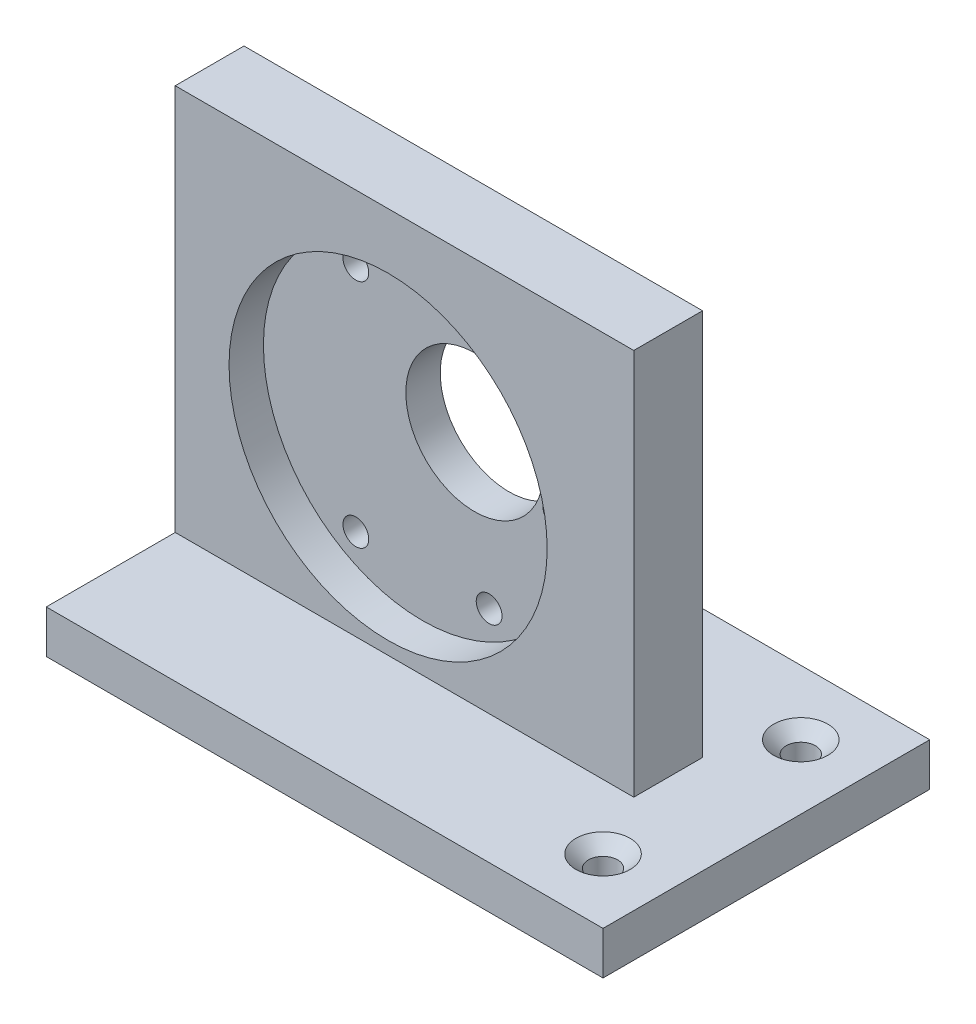
ISO-10303-21;
HEADER;
FILE_DESCRIPTION(('STEP AP214'),'2;1');
FILE_NAME('part.step','',(''),(''),'','','');
FILE_SCHEMA(('AUTOMOTIVE_DESIGN { 1 0 10303 214 1 1 1 1 }'));
ENDSEC;
DATA;
#1=APPLICATION_CONTEXT('core data for automotive mechanical design processes');
#2=APPLICATION_PROTOCOL_DEFINITION('international standard','automotive_design',2000,#1);
#3=PRODUCT_CONTEXT('',#1,'mechanical');
#4=PRODUCT('Part','Part','',(#3));
#5=PRODUCT_RELATED_PRODUCT_CATEGORY('part','',(#4));
#6=PRODUCT_DEFINITION_FORMATION('','',#4);
#7=PRODUCT_DEFINITION_CONTEXT('part definition',#1,'design');
#8=PRODUCT_DEFINITION('design','',#6,#7);
#9=PRODUCT_DEFINITION_SHAPE('','',#8);
#10=(LENGTH_UNIT() NAMED_UNIT(*) SI_UNIT(.MILLI.,.METRE.));
#11=(NAMED_UNIT(*) PLANE_ANGLE_UNIT() SI_UNIT($,.RADIAN.));
#12=(NAMED_UNIT(*) SI_UNIT($,.STERADIAN.) SOLID_ANGLE_UNIT());
#13=UNCERTAINTY_MEASURE_WITH_UNIT(LENGTH_MEASURE(1.E-05),#10,'distance_accuracy_value','');
#14=(GEOMETRIC_REPRESENTATION_CONTEXT(3) GLOBAL_UNCERTAINTY_ASSIGNED_CONTEXT((#13)) GLOBAL_UNIT_ASSIGNED_CONTEXT((#10,
#11,#12)) REPRESENTATION_CONTEXT('',''));
#15=CARTESIAN_POINT('',(0.,0.,0.));
#16=DIRECTION('',(0.,0.,1.));
#17=DIRECTION('',(1.,0.,0.));
#18=AXIS2_PLACEMENT_3D('',#15,#16,#17);
#19=CARTESIAN_POINT('',(-40.,5.,23.));
#20=DIRECTION('',(0.,-1.,0.));
#21=DIRECTION('',(1.,0.,0.));
#22=AXIS2_PLACEMENT_3D('',#19,#20,#21);
#23=PLANE('',#22);
#24=CARTESIAN_POINT('',(32.5,5.00000000000002,-7.5));
#25=DIRECTION('',(0.,1.,0.));
#26=DIRECTION('',(0.,0.,1.));
#27=AXIS2_PLACEMENT_3D('',#24,#25,#26);
#28=CIRCLE('',#27,3.15);
#29=CARTESIAN_POINT('',(32.5,5.00000000000002,-4.35));
#30=VERTEX_POINT('',#29);
#31=EDGE_CURVE('E537',#30,#30,#28,.T.);
#32=ORIENTED_EDGE('',*,*,#31,.F.);
#33=EDGE_LOOP('',(#32));
#34=FACE_BOUND('',#33,.T.);
#35=CARTESIAN_POINT('',(32.5,5.00000000000002,15.5));
#36=DIRECTION('',(0.,1.,0.));
#37=DIRECTION('',(0.,0.,1.));
#38=AXIS2_PLACEMENT_3D('',#35,#36,#37);
#39=CIRCLE('',#38,3.15);
#40=CARTESIAN_POINT('',(32.5,5.00000000000002,18.65));
#41=VERTEX_POINT('',#40);
#42=EDGE_CURVE('E549',#41,#41,#39,.T.);
#43=ORIENTED_EDGE('',*,*,#42,.F.);
#44=EDGE_LOOP('',(#43));
#45=FACE_BOUND('',#44,.T.);
#46=DIRECTION('',(0.,0.,-1.));
#47=VECTOR('',#46,1.);
#48=CARTESIAN_POINT('',(-24.76,5.,23.));
#49=LINE('',#48,#47);
#50=CARTESIAN_POINT('',(-24.76,5.00000000000002,23.));
#51=VERTEX_POINT('',#50);
#52=CARTESIAN_POINT('',(-24.76,5.,8.));
#53=VERTEX_POINT('',#52);
#54=EDGE_CURVE('E265',#51,#53,#49,.T.);
#55=ORIENTED_EDGE('',*,*,#54,.F.);
#56=DIRECTION('',(-1.,0.,0.));
#57=VECTOR('',#56,1.);
#58=CARTESIAN_POINT('',(-40.,5.,23.));
#59=LINE('',#58,#57);
#60=CARTESIAN_POINT('',(40.,5.00000000000002,23.));
#61=VERTEX_POINT('',#60);
#62=EDGE_CURVE('E133',#61,#51,#59,.T.);
#63=ORIENTED_EDGE('',*,*,#62,.F.);
#64=DIRECTION('',(0.,0.,-1.));
#65=VECTOR('',#64,1.);
#66=CARTESIAN_POINT('',(40.,5.00000000000002,23.));
#67=LINE('',#66,#65);
#68=CARTESIAN_POINT('',(40.,5.00000000000002,-15.));
#69=VERTEX_POINT('',#68);
#70=EDGE_CURVE('E155',#61,#69,#67,.T.);
#71=ORIENTED_EDGE('',*,*,#70,.T.);
#72=DIRECTION('',(-1.,0.,0.));
#73=VECTOR('',#72,1.);
#74=CARTESIAN_POINT('',(-40.,5.,-15.));
#75=LINE('',#74,#73);
#76=CARTESIAN_POINT('',(-24.76,5.00000000000002,-15.));
#77=VERTEX_POINT('',#76);
#78=EDGE_CURVE('E143',#69,#77,#75,.T.);
#79=ORIENTED_EDGE('',*,*,#78,.T.);
#80=CARTESIAN_POINT('',(-24.76,5.,0.));
#81=VERTEX_POINT('',#80);
#82=EDGE_CURVE('E266',#81,#77,#49,.T.);
#83=ORIENTED_EDGE('',*,*,#82,.F.);
#84=DIRECTION('',(-1.,0.,0.));
#85=VECTOR('',#84,1.);
#86=CARTESIAN_POINT('',(0.,5.00000000000001,0.));
#87=LINE('',#86,#85);
#88=CARTESIAN_POINT('',(28.575,5.00000000000001,0.));
#89=VERTEX_POINT('',#88);
#90=EDGE_CURVE('E12',#89,#81,#87,.T.);
#91=ORIENTED_EDGE('',*,*,#90,.F.);
#92=DIRECTION('',(0.,0.,-1.));
#93=VECTOR('',#92,1.);
#94=CARTESIAN_POINT('',(28.575,5.00000000000001,8.));
#95=LINE('',#94,#93);
#96=CARTESIAN_POINT('',(28.575,5.00000000000001,8.));
#97=VERTEX_POINT('',#96);
#98=EDGE_CURVE('E160',#97,#89,#95,.T.);
#99=ORIENTED_EDGE('',*,*,#98,.F.);
#100=DIRECTION('',(-1.,0.,0.));
#101=VECTOR('',#100,1.);
#102=CARTESIAN_POINT('',(0.,5.00000000000001,8.));
#103=LINE('',#102,#101);
#104=EDGE_CURVE('E164',#97,#53,#103,.T.);
#105=ORIENTED_EDGE('',*,*,#104,.T.);
#106=EDGE_LOOP('',(#55,#63,#71,#79,#83,#91,#99,#105));
#107=FACE_BOUND('',#106,.T.);
#108=ADVANCED_FACE('F51',(#34,#45,#107),#23,.F.);
#109=CARTESIAN_POINT('',(0.,0.,8.));
#110=DIRECTION('',(0.,0.,-1.));
#111=DIRECTION('',(-1.,0.,0.));
#112=AXIS2_PLACEMENT_3D('',#109,#110,#111);
#113=PLANE('',#112);
#114=CARTESIAN_POINT('',(0.,25.,8.));
#115=DIRECTION('',(0.,0.,1.));
#116=DIRECTION('',(1.,0.,0.));
#117=AXIS2_PLACEMENT_3D('',#114,#115,#116);
#118=CIRCLE('',#117,18.5);
#119=CARTESIAN_POINT('',(18.5,25.,8.));
#120=VERTEX_POINT('',#119);
#121=EDGE_CURVE('E168',#120,#120,#118,.T.);
#122=ORIENTED_EDGE('',*,*,#121,.F.);
#123=EDGE_LOOP('',(#122));
#124=FACE_BOUND('',#123,.T.);
#125=DIRECTION('',(0.,1.,0.));
#126=VECTOR('',#125,1.);
#127=CARTESIAN_POINT('',(-24.76,0.,8.));
#128=LINE('',#127,#126);
#129=CARTESIAN_POINT('',(-24.76,50.,8.));
#130=VERTEX_POINT('',#129);
#131=EDGE_CURVE('E262',#53,#130,#128,.T.);
#132=ORIENTED_EDGE('',*,*,#131,.F.);
#133=ORIENTED_EDGE('',*,*,#104,.F.);
#134=DIRECTION('',(0.,-1.,0.));
#135=VECTOR('',#134,1.);
#136=CARTESIAN_POINT('',(28.575,50.,8.));
#137=LINE('',#136,#135);
#138=CARTESIAN_POINT('',(28.575,50.,8.));
#139=VERTEX_POINT('',#138);
#140=EDGE_CURVE('E224',#139,#97,#137,.T.);
#141=ORIENTED_EDGE('',*,*,#140,.F.);
#142=DIRECTION('',(1.,0.,0.));
#143=VECTOR('',#142,1.);
#144=CARTESIAN_POINT('',(-28.575,50.,8.));
#145=LINE('',#144,#143);
#146=EDGE_CURVE('E76',#130,#139,#145,.T.);
#147=ORIENTED_EDGE('',*,*,#146,.F.);
#148=EDGE_LOOP('',(#132,#133,#141,#147));
#149=FACE_BOUND('',#148,.T.);
#150=ADVANCED_FACE('F255',(#124,#149),#113,.F.);
#151=CARTESIAN_POINT('',(0.,0.,0.));
#152=DIRECTION('',(0.,0.,-1.));
#153=DIRECTION('',(-1.,0.,0.));
#154=AXIS2_PLACEMENT_3D('',#151,#152,#153);
#155=PLANE('',#154);
#156=CARTESIAN_POINT('',(-7.74999999999999,38.4233937586588,0.));
#157=DIRECTION('',(0.,0.,1.));
#158=DIRECTION('',(1.,0.,0.));
#159=AXIS2_PLACEMENT_3D('',#156,#157,#158);
#160=CIRCLE('',#159,1.50000000039213);
#161=CARTESIAN_POINT('',(-6.24999999960786,38.4233937586588,0.));
#162=VERTEX_POINT('',#161);
#163=EDGE_CURVE('E202',#162,#162,#160,.T.);
#164=ORIENTED_EDGE('',*,*,#163,.T.);
#165=EDGE_LOOP('',(#164));
#166=FACE_BOUND('',#165,.T.);
#167=CARTESIAN_POINT('',(-7.74999999999999,11.5766062413412,0.));
#168=DIRECTION('',(0.,0.,1.));
#169=DIRECTION('',(1.,0.,0.));
#170=AXIS2_PLACEMENT_3D('',#167,#168,#169);
#171=CIRCLE('',#170,1.50000000039213);
#172=CARTESIAN_POINT('',(-6.24999999960786,11.5766062413412,0.));
#173=VERTEX_POINT('',#172);
#174=EDGE_CURVE('E207',#173,#173,#171,.T.);
#175=ORIENTED_EDGE('',*,*,#174,.T.);
#176=EDGE_LOOP('',(#175));
#177=FACE_BOUND('',#176,.T.);
#178=CARTESIAN_POINT('',(7.75000000000001,11.5766062413412,0.));
#179=DIRECTION('',(0.,0.,1.));
#180=DIRECTION('',(1.,0.,0.));
#181=AXIS2_PLACEMENT_3D('',#178,#179,#180);
#182=CIRCLE('',#181,1.50000000039213);
#183=CARTESIAN_POINT('',(9.25000000039214,11.5766062413412,0.));
#184=VERTEX_POINT('',#183);
#185=EDGE_CURVE('E211',#184,#184,#182,.T.);
#186=ORIENTED_EDGE('',*,*,#185,.T.);
#187=EDGE_LOOP('',(#186));
#188=FACE_BOUND('',#187,.T.);
#189=CARTESIAN_POINT('',(15.5,25.,0.));
#190=DIRECTION('',(0.,0.,1.));
#191=DIRECTION('',(1.,0.,0.));
#192=AXIS2_PLACEMENT_3D('',#189,#190,#191);
#193=CIRCLE('',#192,1.50000000039213);
#194=CARTESIAN_POINT('',(17.0000000003921,25.,0.));
#195=VERTEX_POINT('',#194);
#196=EDGE_CURVE('E201',#195,#195,#193,.T.);
#197=ORIENTED_EDGE('',*,*,#196,.T.);
#198=EDGE_LOOP('',(#197));
#199=FACE_BOUND('',#198,.T.);
#200=CARTESIAN_POINT('',(6.06217782532956,28.4999999993294,0.));
#201=DIRECTION('',(0.,0.,1.));
#202=DIRECTION('',(1.,0.,0.));
#203=AXIS2_PLACEMENT_3D('',#200,#201,#202);
#204=CIRCLE('',#203,8.00000000000001);
#205=CARTESIAN_POINT('',(14.0621778253296,28.4999999993294,0.));
#206=VERTEX_POINT('',#205);
#207=EDGE_CURVE('E197',#206,#206,#204,.T.);
#208=ORIENTED_EDGE('',*,*,#207,.T.);
#209=EDGE_LOOP('',(#208));
#210=FACE_BOUND('',#209,.T.);
#211=CARTESIAN_POINT('',(7.74999999999999,38.4233937586588,0.));
#212=DIRECTION('',(0.,0.,1.));
#213=DIRECTION('',(1.,0.,0.));
#214=AXIS2_PLACEMENT_3D('',#211,#212,#213);
#215=CIRCLE('',#214,1.50000000039214);
#216=CARTESIAN_POINT('',(9.25000000039213,38.4233937586588,0.));
#217=VERTEX_POINT('',#216);
#218=EDGE_CURVE('E206',#217,#217,#215,.T.);
#219=ORIENTED_EDGE('',*,*,#218,.T.);
#220=EDGE_LOOP('',(#219));
#221=FACE_BOUND('',#220,.T.);
#222=ORIENTED_EDGE('',*,*,#90,.T.);
#223=DIRECTION('',(0.,1.,0.));
#224=VECTOR('',#223,1.);
#225=CARTESIAN_POINT('',(-24.76,0.,0.));
#226=LINE('',#225,#224);
#227=CARTESIAN_POINT('',(-24.76,50.,0.));
#228=VERTEX_POINT('',#227);
#229=EDGE_CURVE('E135',#81,#228,#226,.T.);
#230=ORIENTED_EDGE('',*,*,#229,.T.);
#231=DIRECTION('',(1.,0.,0.));
#232=VECTOR('',#231,1.);
#233=CARTESIAN_POINT('',(-28.575,50.,0.));
#234=LINE('',#233,#232);
#235=CARTESIAN_POINT('',(28.575,50.,0.));
#236=VERTEX_POINT('',#235);
#237=EDGE_CURVE('E221',#228,#236,#234,.T.);
#238=ORIENTED_EDGE('',*,*,#237,.T.);
#239=DIRECTION('',(0.,-1.,0.));
#240=VECTOR('',#239,1.);
#241=CARTESIAN_POINT('',(28.575,50.,0.));
#242=LINE('',#241,#240);
#243=EDGE_CURVE('E225',#236,#89,#242,.T.);
#244=ORIENTED_EDGE('',*,*,#243,.T.);
#245=EDGE_LOOP('',(#222,#230,#238,#244));
#246=FACE_BOUND('',#245,.T.);
#247=ADVANCED_FACE('F258',(#166,#177,#188,#199,#210,#221,#246),#155,.T.);
#248=CARTESIAN_POINT('',(-28.575,50.,8.));
#249=DIRECTION('',(0.,1.,0.));
#250=DIRECTION('',(-1.,0.,0.));
#251=AXIS2_PLACEMENT_3D('',#248,#249,#250);
#252=PLANE('',#251);
#253=ORIENTED_EDGE('',*,*,#237,.F.);
#254=DIRECTION('',(0.,0.,-1.));
#255=VECTOR('',#254,1.);
#256=CARTESIAN_POINT('',(-24.76,50.,-15.));
#257=LINE('',#256,#255);
#258=EDGE_CURVE('E125',#130,#228,#257,.T.);
#259=ORIENTED_EDGE('',*,*,#258,.F.);
#260=ORIENTED_EDGE('',*,*,#146,.T.);
#261=DIRECTION('',(0.,0.,-1.));
#262=VECTOR('',#261,1.);
#263=CARTESIAN_POINT('',(28.575,50.,8.));
#264=LINE('',#263,#262);
#265=EDGE_CURVE('E60',#139,#236,#264,.T.);
#266=ORIENTED_EDGE('',*,*,#265,.T.);
#267=EDGE_LOOP('',(#253,#259,#260,#266));
#268=FACE_BOUND('',#267,.T.);
#269=ADVANCED_FACE('F53',(#268),#252,.T.);
#270=CARTESIAN_POINT('',(0.,0.,23.));
#271=DIRECTION('',(0.,0.,1.));
#272=DIRECTION('',(1.,0.,0.));
#273=AXIS2_PLACEMENT_3D('',#270,#271,#272);
#274=PLANE('',#273);
#275=ORIENTED_EDGE('',*,*,#62,.T.);
#276=DIRECTION('',(0.,-1.,0.));
#277=VECTOR('',#276,1.);
#278=CARTESIAN_POINT('',(-24.76,50.,23.));
#279=LINE('',#278,#277);
#280=CARTESIAN_POINT('',(-24.76,0.,23.));
#281=VERTEX_POINT('',#280);
#282=EDGE_CURVE('E119',#51,#281,#279,.T.);
#283=ORIENTED_EDGE('',*,*,#282,.T.);
#284=DIRECTION('',(1.,0.,0.));
#285=VECTOR('',#284,1.);
#286=CARTESIAN_POINT('',(-40.,0.,23.));
#287=LINE('',#286,#285);
#288=CARTESIAN_POINT('',(40.,0.,23.));
#289=VERTEX_POINT('',#288);
#290=EDGE_CURVE('E130',#281,#289,#287,.T.);
#291=ORIENTED_EDGE('',*,*,#290,.T.);
#292=DIRECTION('',(0.,1.,0.));
#293=VECTOR('',#292,1.);
#294=CARTESIAN_POINT('',(40.,5.00000000000002,23.));
#295=LINE('',#294,#293);
#296=EDGE_CURVE('E142',#289,#61,#295,.T.);
#297=ORIENTED_EDGE('',*,*,#296,.T.);
#298=EDGE_LOOP('',(#275,#283,#291,#297));
#299=FACE_BOUND('',#298,.T.);
#300=ADVANCED_FACE('F129',(#299),#274,.T.);
#301=CARTESIAN_POINT('',(0.,0.,-15.));
#302=DIRECTION('',(0.,0.,1.));
#303=DIRECTION('',(1.,0.,0.));
#304=AXIS2_PLACEMENT_3D('',#301,#302,#303);
#305=PLANE('',#304);
#306=DIRECTION('',(0.,-1.,0.));
#307=VECTOR('',#306,1.);
#308=CARTESIAN_POINT('',(-24.76,50.,-15.));
#309=LINE('',#308,#307);
#310=CARTESIAN_POINT('',(-24.76,0.,-15.));
#311=VERTEX_POINT('',#310);
#312=EDGE_CURVE('E67',#77,#311,#309,.T.);
#313=ORIENTED_EDGE('',*,*,#312,.F.);
#314=ORIENTED_EDGE('',*,*,#78,.F.);
#315=DIRECTION('',(0.,1.,0.));
#316=VECTOR('',#315,1.);
#317=CARTESIAN_POINT('',(40.,5.00000000000002,-15.));
#318=LINE('',#317,#316);
#319=CARTESIAN_POINT('',(40.,0.,-15.));
#320=VERTEX_POINT('',#319);
#321=EDGE_CURVE('E149',#320,#69,#318,.T.);
#322=ORIENTED_EDGE('',*,*,#321,.F.);
#323=DIRECTION('',(1.,0.,0.));
#324=VECTOR('',#323,1.);
#325=CARTESIAN_POINT('',(-40.,0.,-15.));
#326=LINE('',#325,#324);
#327=EDGE_CURVE('E520',#311,#320,#326,.T.);
#328=ORIENTED_EDGE('',*,*,#327,.F.);
#329=EDGE_LOOP('',(#313,#314,#322,#328));
#330=FACE_BOUND('',#329,.T.);
#331=ADVANCED_FACE('F281',(#330),#305,.F.);
#332=CARTESIAN_POINT('',(-28.575,0.,8.));
#333=DIRECTION('',(0.,1.,0.));
#334=DIRECTION('',(-1.,0.,0.));
#335=AXIS2_PLACEMENT_3D('',#332,#333,#334);
#336=PLANE('',#335);
#337=CARTESIAN_POINT('',(32.5,0.,-7.5));
#338=DIRECTION('',(0.,1.,0.));
#339=DIRECTION('',(0.,0.,1.));
#340=AXIS2_PLACEMENT_3D('',#337,#338,#339);
#341=CIRCLE('',#340,1.69999999999999);
#342=CARTESIAN_POINT('',(32.5,0.,-5.80000000000001));
#343=VERTEX_POINT('',#342);
#344=EDGE_CURVE('E527',#343,#343,#341,.T.);
#345=ORIENTED_EDGE('',*,*,#344,.T.);
#346=EDGE_LOOP('',(#345));
#347=FACE_BOUND('',#346,.T.);
#348=CARTESIAN_POINT('',(32.5,0.,15.5));
#349=DIRECTION('',(0.,1.,0.));
#350=DIRECTION('',(0.,0.,1.));
#351=AXIS2_PLACEMENT_3D('',#348,#349,#350);
#352=CIRCLE('',#351,1.69999999999999);
#353=CARTESIAN_POINT('',(32.5,0.,17.2));
#354=VERTEX_POINT('',#353);
#355=EDGE_CURVE('E541',#354,#354,#352,.T.);
#356=ORIENTED_EDGE('',*,*,#355,.T.);
#357=EDGE_LOOP('',(#356));
#358=FACE_BOUND('',#357,.T.);
#359=DIRECTION('',(0.,0.,1.));
#360=VECTOR('',#359,1.);
#361=CARTESIAN_POINT('',(-24.76,0.,-15.));
#362=LINE('',#361,#360);
#363=EDGE_CURVE('E116',#311,#281,#362,.T.);
#364=ORIENTED_EDGE('',*,*,#363,.F.);
#365=ORIENTED_EDGE('',*,*,#327,.T.);
#366=DIRECTION('',(0.,0.,-1.));
#367=VECTOR('',#366,1.);
#368=CARTESIAN_POINT('',(40.,0.,23.));
#369=LINE('',#368,#367);
#370=EDGE_CURVE('E139',#289,#320,#369,.T.);
#371=ORIENTED_EDGE('',*,*,#370,.F.);
#372=ORIENTED_EDGE('',*,*,#290,.F.);
#373=EDGE_LOOP('',(#364,#365,#371,#372));
#374=FACE_BOUND('',#373,.T.);
#375=ADVANCED_FACE('F137',(#347,#358,#374),#336,.F.);
#376=CARTESIAN_POINT('',(28.575,50.,8.));
#377=DIRECTION('',(1.,0.,0.));
#378=DIRECTION('',(0.,1.,0.));
#379=AXIS2_PLACEMENT_3D('',#376,#377,#378);
#380=PLANE('',#379);
#381=ORIENTED_EDGE('',*,*,#140,.T.);
#382=ORIENTED_EDGE('',*,*,#98,.T.);
#383=ORIENTED_EDGE('',*,*,#243,.F.);
#384=ORIENTED_EDGE('',*,*,#265,.F.);
#385=EDGE_LOOP('',(#381,#382,#383,#384));
#386=FACE_BOUND('',#385,.T.);
#387=ADVANCED_FACE('F272',(#386),#380,.T.);
#388=CARTESIAN_POINT('',(7.74999999999999,38.4233937586588,10.));
#389=DIRECTION('',(0.,0.,-1.));
#390=DIRECTION('',(-1.,0.,0.));
#391=AXIS2_PLACEMENT_3D('',#388,#389,#390);
#392=CYLINDRICAL_SURFACE('',#391,1.50000000039214);
#393=ORIENTED_EDGE('',*,*,#218,.F.);
#394=EDGE_LOOP('',(#393));
#395=FACE_BOUND('',#394,.T.);
#396=CARTESIAN_POINT('',(7.74999999999999,38.4233937586588,4.));
#397=DIRECTION('',(0.,0.,1.));
#398=DIRECTION('',(1.,0.,0.));
#399=AXIS2_PLACEMENT_3D('',#396,#397,#398);
#400=CIRCLE('',#399,1.50000000039214);
#401=CARTESIAN_POINT('',(9.25000000039213,38.4233937586588,4.));
#402=VERTEX_POINT('',#401);
#403=EDGE_CURVE('E193',#402,#402,#400,.T.);
#404=ORIENTED_EDGE('',*,*,#403,.T.);
#405=EDGE_LOOP('',(#404));
#406=FACE_BOUND('',#405,.T.);
#407=ADVANCED_FACE('F302',(#395,#406),#392,.F.);
#408=CARTESIAN_POINT('',(6.06217782532956,28.4999999993294,10.));
#409=DIRECTION('',(0.,0.,-1.));
#410=DIRECTION('',(-1.,0.,0.));
#411=AXIS2_PLACEMENT_3D('',#408,#409,#410);
#412=CYLINDRICAL_SURFACE('',#411,8.00000000000001);
#413=ORIENTED_EDGE('',*,*,#207,.F.);
#414=EDGE_LOOP('',(#413));
#415=FACE_BOUND('',#414,.T.);
#416=CARTESIAN_POINT('',(6.06217782532956,28.4999999993294,4.));
#417=DIRECTION('',(0.,0.,1.));
#418=DIRECTION('',(1.,0.,0.));
#419=AXIS2_PLACEMENT_3D('',#416,#417,#418);
#420=CIRCLE('',#419,8.00000000000001);
#421=CARTESIAN_POINT('',(14.0621778253296,28.4999999993294,4.));
#422=VERTEX_POINT('',#421);
#423=EDGE_CURVE('E189',#422,#422,#420,.T.);
#424=ORIENTED_EDGE('',*,*,#423,.T.);
#425=EDGE_LOOP('',(#424));
#426=FACE_BOUND('',#425,.T.);
#427=ADVANCED_FACE('F298',(#415,#426),#412,.F.);
#428=CARTESIAN_POINT('',(15.5,25.,10.));
#429=DIRECTION('',(0.,0.,-1.));
#430=DIRECTION('',(-1.,0.,0.));
#431=AXIS2_PLACEMENT_3D('',#428,#429,#430);
#432=CYLINDRICAL_SURFACE('',#431,1.50000000039213);
#433=ORIENTED_EDGE('',*,*,#196,.F.);
#434=EDGE_LOOP('',(#433));
#435=FACE_BOUND('',#434,.T.);
#436=CARTESIAN_POINT('',(15.5,25.,4.));
#437=DIRECTION('',(0.,0.,1.));
#438=DIRECTION('',(1.,0.,0.));
#439=AXIS2_PLACEMENT_3D('',#436,#437,#438);
#440=CIRCLE('',#439,1.50000000039213);
#441=CARTESIAN_POINT('',(17.0000000003921,25.,4.));
#442=VERTEX_POINT('',#441);
#443=EDGE_CURVE('E185',#442,#442,#440,.T.);
#444=ORIENTED_EDGE('',*,*,#443,.T.);
#445=EDGE_LOOP('',(#444));
#446=FACE_BOUND('',#445,.T.);
#447=ADVANCED_FACE('F301',(#435,#446),#432,.F.);
#448=CARTESIAN_POINT('',(7.75000000000001,11.5766062413412,10.));
#449=DIRECTION('',(0.,0.,-1.));
#450=DIRECTION('',(-1.,0.,0.));
#451=AXIS2_PLACEMENT_3D('',#448,#449,#450);
#452=CYLINDRICAL_SURFACE('',#451,1.50000000039213);
#453=ORIENTED_EDGE('',*,*,#185,.F.);
#454=EDGE_LOOP('',(#453));
#455=FACE_BOUND('',#454,.T.);
#456=CARTESIAN_POINT('',(7.75000000000001,11.5766062413412,4.));
#457=DIRECTION('',(0.,0.,1.));
#458=DIRECTION('',(1.,0.,0.));
#459=AXIS2_PLACEMENT_3D('',#456,#457,#458);
#460=CIRCLE('',#459,1.50000000039213);
#461=CARTESIAN_POINT('',(9.25000000039214,11.5766062413412,4.));
#462=VERTEX_POINT('',#461);
#463=EDGE_CURVE('E181',#462,#462,#460,.T.);
#464=ORIENTED_EDGE('',*,*,#463,.T.);
#465=EDGE_LOOP('',(#464));
#466=FACE_BOUND('',#465,.T.);
#467=ADVANCED_FACE('F310',(#455,#466),#452,.F.);
#468=CARTESIAN_POINT('',(-7.74999999999999,11.5766062413412,10.));
#469=DIRECTION('',(0.,0.,-1.));
#470=DIRECTION('',(-1.,0.,0.));
#471=AXIS2_PLACEMENT_3D('',#468,#469,#470);
#472=CYLINDRICAL_SURFACE('',#471,1.50000000039213);
#473=ORIENTED_EDGE('',*,*,#174,.F.);
#474=EDGE_LOOP('',(#473));
#475=FACE_BOUND('',#474,.T.);
#476=CARTESIAN_POINT('',(-7.74999999999999,11.5766062413412,4.));
#477=DIRECTION('',(0.,0.,1.));
#478=DIRECTION('',(1.,0.,0.));
#479=AXIS2_PLACEMENT_3D('',#476,#477,#478);
#480=CIRCLE('',#479,1.50000000039213);
#481=CARTESIAN_POINT('',(-6.24999999960786,11.5766062413412,4.));
#482=VERTEX_POINT('',#481);
#483=EDGE_CURVE('E177',#482,#482,#480,.T.);
#484=ORIENTED_EDGE('',*,*,#483,.T.);
#485=EDGE_LOOP('',(#484));
#486=FACE_BOUND('',#485,.T.);
#487=ADVANCED_FACE('F306',(#475,#486),#472,.F.);
#488=CARTESIAN_POINT('',(-7.74999999999999,38.4233937586588,10.));
#489=DIRECTION('',(0.,0.,-1.));
#490=DIRECTION('',(-1.,0.,0.));
#491=AXIS2_PLACEMENT_3D('',#488,#489,#490);
#492=CYLINDRICAL_SURFACE('',#491,1.50000000039213);
#493=ORIENTED_EDGE('',*,*,#163,.F.);
#494=EDGE_LOOP('',(#493));
#495=FACE_BOUND('',#494,.T.);
#496=CARTESIAN_POINT('',(-7.74999999999999,38.4233937586588,4.));
#497=DIRECTION('',(0.,0.,1.));
#498=DIRECTION('',(1.,0.,0.));
#499=AXIS2_PLACEMENT_3D('',#496,#497,#498);
#500=CIRCLE('',#499,1.50000000039213);
#501=CARTESIAN_POINT('',(-6.24999999960786,38.4233937586588,4.));
#502=VERTEX_POINT('',#501);
#503=EDGE_CURVE('E173',#502,#502,#500,.T.);
#504=ORIENTED_EDGE('',*,*,#503,.T.);
#505=EDGE_LOOP('',(#504));
#506=FACE_BOUND('',#505,.T.);
#507=ADVANCED_FACE('F239',(#495,#506),#492,.F.);
#508=CARTESIAN_POINT('',(0.,25.,4.));
#509=DIRECTION('',(0.,0.,1.));
#510=DIRECTION('',(1.,0.,0.));
#511=AXIS2_PLACEMENT_3D('',#508,#509,#510);
#512=CYLINDRICAL_SURFACE('',#511,18.5);
#513=CARTESIAN_POINT('',(0.,25.,4.));
#514=DIRECTION('',(0.,0.,1.));
#515=DIRECTION('',(1.,0.,0.));
#516=AXIS2_PLACEMENT_3D('',#513,#514,#515);
#517=CIRCLE('',#516,18.5);
#518=CARTESIAN_POINT('',(18.5,25.,4.));
#519=VERTEX_POINT('',#518);
#520=EDGE_CURVE('E169',#519,#519,#517,.T.);
#521=ORIENTED_EDGE('',*,*,#520,.F.);
#522=EDGE_LOOP('',(#521));
#523=FACE_BOUND('',#522,.T.);
#524=ORIENTED_EDGE('',*,*,#121,.T.);
#525=EDGE_LOOP('',(#524));
#526=FACE_BOUND('',#525,.T.);
#527=ADVANCED_FACE('F245',(#523,#526),#512,.F.);
#528=CARTESIAN_POINT('',(0.,25.,4.));
#529=DIRECTION('',(0.,0.,1.));
#530=DIRECTION('',(1.,0.,0.));
#531=AXIS2_PLACEMENT_3D('',#528,#529,#530);
#532=PLANE('',#531);
#533=ORIENTED_EDGE('',*,*,#403,.F.);
#534=EDGE_LOOP('',(#533));
#535=FACE_BOUND('',#534,.T.);
#536=ORIENTED_EDGE('',*,*,#423,.F.);
#537=EDGE_LOOP('',(#536));
#538=FACE_BOUND('',#537,.T.);
#539=ORIENTED_EDGE('',*,*,#443,.F.);
#540=EDGE_LOOP('',(#539));
#541=FACE_BOUND('',#540,.T.);
#542=ORIENTED_EDGE('',*,*,#463,.F.);
#543=EDGE_LOOP('',(#542));
#544=FACE_BOUND('',#543,.T.);
#545=ORIENTED_EDGE('',*,*,#483,.F.);
#546=EDGE_LOOP('',(#545));
#547=FACE_BOUND('',#546,.T.);
#548=ORIENTED_EDGE('',*,*,#503,.F.);
#549=EDGE_LOOP('',(#548));
#550=FACE_BOUND('',#549,.T.);
#551=ORIENTED_EDGE('',*,*,#520,.T.);
#552=EDGE_LOOP('',(#551));
#553=FACE_BOUND('',#552,.T.);
#554=ADVANCED_FACE('F241',(#535,#538,#541,#544,#547,#550,#553),#532,.T.);
#555=CARTESIAN_POINT('',(40.,5.00000000000002,23.));
#556=DIRECTION('',(-1.,0.,0.));
#557=DIRECTION('',(0.,0.,1.));
#558=AXIS2_PLACEMENT_3D('',#555,#556,#557);
#559=PLANE('',#558);
#560=ORIENTED_EDGE('',*,*,#370,.T.);
#561=ORIENTED_EDGE('',*,*,#321,.T.);
#562=ORIENTED_EDGE('',*,*,#70,.F.);
#563=ORIENTED_EDGE('',*,*,#296,.F.);
#564=EDGE_LOOP('',(#560,#561,#562,#563));
#565=FACE_BOUND('',#564,.T.);
#566=ADVANCED_FACE('F244',(#565),#559,.F.);
#567=CARTESIAN_POINT('',(32.5,5.00000000000001,-7.5));
#568=DIRECTION('',(0.,1.,0.));
#569=DIRECTION('',(0.,0.,1.));
#570=AXIS2_PLACEMENT_3D('',#567,#568,#569);
#571=CYLINDRICAL_SURFACE('',#570,1.69999999999999);
#572=ORIENTED_EDGE('',*,*,#344,.F.);
#573=EDGE_LOOP('',(#572));
#574=FACE_BOUND('',#573,.T.);
#575=CARTESIAN_POINT('',(32.5,3.55000000000001,-7.5));
#576=DIRECTION('',(0.,1.,0.));
#577=DIRECTION('',(0.,0.,1.));
#578=AXIS2_PLACEMENT_3D('',#575,#576,#577);
#579=CIRCLE('',#578,1.69999999999999);
#580=CARTESIAN_POINT('',(32.5,3.55000000000001,-5.80000000000001));
#581=VERTEX_POINT('',#580);
#582=EDGE_CURVE('E533',#581,#581,#579,.T.);
#583=ORIENTED_EDGE('',*,*,#582,.T.);
#584=EDGE_LOOP('',(#583));
#585=FACE_BOUND('',#584,.T.);
#586=ADVANCED_FACE('F295',(#574,#585),#571,.F.);
#587=CARTESIAN_POINT('',(32.5,5.00000000000002,-7.5));
#588=DIRECTION('',(0.,1.,0.));
#589=DIRECTION('',(0.,0.,1.));
#590=AXIS2_PLACEMENT_3D('',#587,#588,#589);
#591=CONICAL_SURFACE('',#590,3.15,0.78539816339745);
#592=ORIENTED_EDGE('',*,*,#582,.F.);
#593=EDGE_LOOP('',(#592));
#594=FACE_BOUND('',#593,.T.);
#595=ORIENTED_EDGE('',*,*,#31,.T.);
#596=EDGE_LOOP('',(#595));
#597=FACE_BOUND('',#596,.T.);
#598=ADVANCED_FACE('F371',(#594,#597),#591,.F.);
#599=CARTESIAN_POINT('',(32.5,5.00000000000001,15.5));
#600=DIRECTION('',(0.,1.,0.));
#601=DIRECTION('',(0.,0.,1.));
#602=AXIS2_PLACEMENT_3D('',#599,#600,#601);
#603=CYLINDRICAL_SURFACE('',#602,1.69999999999999);
#604=ORIENTED_EDGE('',*,*,#355,.F.);
#605=EDGE_LOOP('',(#604));
#606=FACE_BOUND('',#605,.T.);
#607=CARTESIAN_POINT('',(32.5,3.55000000000001,15.5));
#608=DIRECTION('',(0.,1.,0.));
#609=DIRECTION('',(0.,0.,1.));
#610=AXIS2_PLACEMENT_3D('',#607,#608,#609);
#611=CIRCLE('',#610,1.69999999999999);
#612=CARTESIAN_POINT('',(32.5,3.55000000000001,17.2));
#613=VERTEX_POINT('',#612);
#614=EDGE_CURVE('E545',#613,#613,#611,.T.);
#615=ORIENTED_EDGE('',*,*,#614,.T.);
#616=EDGE_LOOP('',(#615));
#617=FACE_BOUND('',#616,.T.);
#618=ADVANCED_FACE('F379',(#606,#617),#603,.F.);
#619=CARTESIAN_POINT('',(32.5,5.00000000000002,15.5));
#620=DIRECTION('',(0.,1.,0.));
#621=DIRECTION('',(0.,0.,1.));
#622=AXIS2_PLACEMENT_3D('',#619,#620,#621);
#623=CONICAL_SURFACE('',#622,3.15,0.78539816339745);
#624=ORIENTED_EDGE('',*,*,#614,.F.);
#625=EDGE_LOOP('',(#624));
#626=FACE_BOUND('',#625,.T.);
#627=ORIENTED_EDGE('',*,*,#42,.T.);
#628=EDGE_LOOP('',(#627));
#629=FACE_BOUND('',#628,.T.);
#630=ADVANCED_FACE('F387',(#626,#629),#623,.F.);
#631=CARTESIAN_POINT('',(-24.76,50.,-15.));
#632=DIRECTION('',(-1.,0.,0.));
#633=DIRECTION('',(0.,-1.,0.));
#634=AXIS2_PLACEMENT_3D('',#631,#632,#633);
#635=PLANE('',#634);
#636=ORIENTED_EDGE('',*,*,#54,.T.);
#637=ORIENTED_EDGE('',*,*,#131,.T.);
#638=ORIENTED_EDGE('',*,*,#258,.T.);
#639=ORIENTED_EDGE('',*,*,#229,.F.);
#640=ORIENTED_EDGE('',*,*,#82,.T.);
#641=ORIENTED_EDGE('',*,*,#312,.T.);
#642=ORIENTED_EDGE('',*,*,#363,.T.);
#643=ORIENTED_EDGE('',*,*,#282,.F.);
#644=EDGE_LOOP('',(#636,#637,#638,#639,#640,#641,#642,#643));
#645=FACE_BOUND('',#644,.T.);
#646=ADVANCED_FACE('F118',(#645),#635,.T.);
#647=CLOSED_SHELL('',(#108,#150,#247,#269,#300,#331,#375,#387,#407,#427,#447,#467,#487,#507,
#527,#554,#566,#586,#598,#618,#630,#646));
#648=MANIFOLD_SOLID_BREP('B2',#647);
#649=ADVANCED_BREP_SHAPE_REPRESENTATION('',(#18,#648),#14);
#650=SHAPE_DEFINITION_REPRESENTATION(#9,#649);
ENDSEC;
END-ISO-10303-21;
